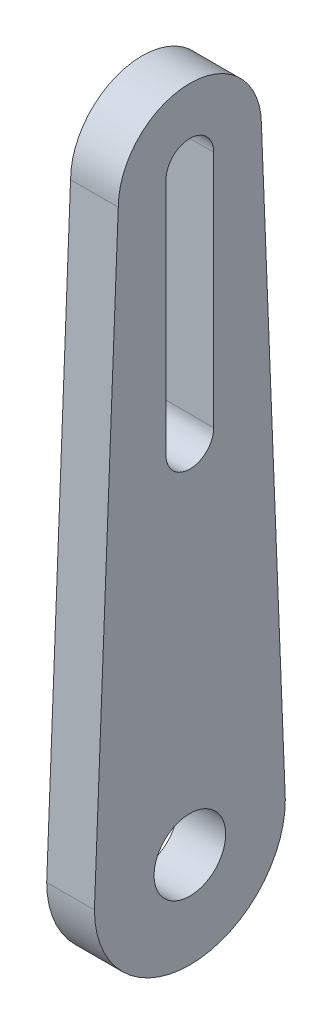
ISO-10303-21;
HEADER;
FILE_DESCRIPTION(('STEP AP214'),'2;1');
FILE_NAME('part.step','',(''),(''),'','','');
FILE_SCHEMA(('AUTOMOTIVE_DESIGN { 1 0 10303 214 1 1 1 1 }'));
ENDSEC;
DATA;
#1=APPLICATION_CONTEXT('core data for automotive mechanical design processes');
#2=APPLICATION_PROTOCOL_DEFINITION('international standard','automotive_design',2000,#1);
#3=PRODUCT_CONTEXT('',#1,'mechanical');
#4=PRODUCT('Part','Part','',(#3));
#5=PRODUCT_RELATED_PRODUCT_CATEGORY('part','',(#4));
#6=PRODUCT_DEFINITION_FORMATION('','',#4);
#7=PRODUCT_DEFINITION_CONTEXT('part definition',#1,'design');
#8=PRODUCT_DEFINITION('design','',#6,#7);
#9=PRODUCT_DEFINITION_SHAPE('','',#8);
#10=(LENGTH_UNIT() NAMED_UNIT(*) SI_UNIT(.MILLI.,.METRE.));
#11=(NAMED_UNIT(*) PLANE_ANGLE_UNIT() SI_UNIT($,.RADIAN.));
#12=(NAMED_UNIT(*) SI_UNIT($,.STERADIAN.) SOLID_ANGLE_UNIT());
#13=UNCERTAINTY_MEASURE_WITH_UNIT(LENGTH_MEASURE(1.E-05),#10,'distance_accuracy_value','');
#14=(GEOMETRIC_REPRESENTATION_CONTEXT(3) GLOBAL_UNCERTAINTY_ASSIGNED_CONTEXT((#13)) GLOBAL_UNIT_ASSIGNED_CONTEXT((#10,
#11,#12)) REPRESENTATION_CONTEXT('',''));
#15=CARTESIAN_POINT('',(0.,0.,0.));
#16=DIRECTION('',(0.,0.,1.));
#17=DIRECTION('',(1.,0.,0.));
#18=AXIS2_PLACEMENT_3D('',#15,#16,#17);
#19=CARTESIAN_POINT('',(2.,0.,0.));
#20=DIRECTION('',(1.,0.,0.));
#21=DIRECTION('',(0.,0.,-1.));
#22=AXIS2_PLACEMENT_3D('',#19,#20,#21);
#23=PLANE('',#22);
#24=CARTESIAN_POINT('',(2.,0.,0.));
#25=DIRECTION('',(1.,0.,0.));
#26=DIRECTION('',(0.,0.,-1.));
#27=AXIS2_PLACEMENT_3D('',#24,#25,#26);
#28=CIRCLE('',#27,8.);
#29=CARTESIAN_POINT('',(2.,0.,8.));
#30=VERTEX_POINT('',#29);
#31=CARTESIAN_POINT('',(2.,0.,-8.));
#32=VERTEX_POINT('',#31);
#33=EDGE_CURVE('E161',#30,#32,#28,.T.);
#34=ORIENTED_EDGE('',*,*,#33,.T.);
#35=DIRECTION('',(0.,0.999200958721789,0.0399680383488716));
#36=VECTOR('',#35,1.);
#37=CARTESIAN_POINT('',(2.,50.,-6.));
#38=LINE('',#37,#36);
#39=CARTESIAN_POINT('',(2.,50.,-6.));
#40=VERTEX_POINT('',#39);
#41=EDGE_CURVE('E165',#32,#40,#38,.T.);
#42=ORIENTED_EDGE('',*,*,#41,.T.);
#43=CARTESIAN_POINT('',(2.,50.,0.));
#44=DIRECTION('',(1.,0.,0.));
#45=DIRECTION('',(0.,0.,1.));
#46=AXIS2_PLACEMENT_3D('',#43,#44,#45);
#47=CIRCLE('',#46,6.);
#48=CARTESIAN_POINT('',(2.,50.,6.));
#49=VERTEX_POINT('',#48);
#50=EDGE_CURVE('E169',#40,#49,#47,.T.);
#51=ORIENTED_EDGE('',*,*,#50,.T.);
#52=DIRECTION('',(0.,-0.999200958721789,0.0399680383488716));
#53=VECTOR('',#52,1.);
#54=CARTESIAN_POINT('',(2.,0.,8.));
#55=LINE('',#54,#53);
#56=EDGE_CURVE('E172',#49,#30,#55,.T.);
#57=ORIENTED_EDGE('',*,*,#56,.T.);
#58=EDGE_LOOP('',(#34,#42,#51,#57));
#59=FACE_BOUND('',#58,.T.);
#60=CARTESIAN_POINT('',(2.,0.,0.));
#61=DIRECTION('',(1.,0.,0.));
#62=DIRECTION('',(0.,0.,-1.));
#63=AXIS2_PLACEMENT_3D('',#60,#61,#62);
#64=CIRCLE('',#63,3.);
#65=CARTESIAN_POINT('',(2.,0.,-3.));
#66=VERTEX_POINT('',#65);
#67=EDGE_CURVE('E153',#66,#66,#64,.T.);
#68=ORIENTED_EDGE('',*,*,#67,.F.);
#69=EDGE_LOOP('',(#68));
#70=FACE_BOUND('',#69,.T.);
#71=DIRECTION('',(0.,-1.,0.));
#72=VECTOR('',#71,1.);
#73=CARTESIAN_POINT('',(2.,50.,1.99999999999999));
#74=LINE('',#73,#72);
#75=CARTESIAN_POINT('',(2.,50.,1.99999999999999));
#76=VERTEX_POINT('',#75);
#77=CARTESIAN_POINT('',(2.,30.,2.));
#78=VERTEX_POINT('',#77);
#79=EDGE_CURVE('E114',#76,#78,#74,.T.);
#80=ORIENTED_EDGE('',*,*,#79,.F.);
#81=CARTESIAN_POINT('',(2.,50.,0.));
#82=DIRECTION('',(1.,0.,0.));
#83=DIRECTION('',(0.,0.,-1.));
#84=AXIS2_PLACEMENT_3D('',#81,#82,#83);
#85=CIRCLE('',#84,2.);
#86=CARTESIAN_POINT('',(2.,50.,-2.00000000000001));
#87=VERTEX_POINT('',#86);
#88=EDGE_CURVE('E105',#87,#76,#85,.T.);
#89=ORIENTED_EDGE('',*,*,#88,.F.);
#90=DIRECTION('',(0.,1.,0.));
#91=VECTOR('',#90,1.);
#92=CARTESIAN_POINT('',(2.,50.,-2.00000000000001));
#93=LINE('',#92,#91);
#94=CARTESIAN_POINT('',(2.,30.,-2.));
#95=VERTEX_POINT('',#94);
#96=EDGE_CURVE('E131',#95,#87,#93,.T.);
#97=ORIENTED_EDGE('',*,*,#96,.F.);
#98=CARTESIAN_POINT('',(2.,30.,0.));
#99=DIRECTION('',(1.,0.,0.));
#100=DIRECTION('',(0.,0.,-1.));
#101=AXIS2_PLACEMENT_3D('',#98,#99,#100);
#102=CIRCLE('',#101,2.);
#103=EDGE_CURVE('E127',#78,#95,#102,.T.);
#104=ORIENTED_EDGE('',*,*,#103,.F.);
#105=EDGE_LOOP('',(#80,#89,#97,#104));
#106=FACE_BOUND('',#105,.T.);
#107=ADVANCED_FACE('F39',(#59,#70,#106),#23,.T.);
#108=CARTESIAN_POINT('',(-2.,0.,0.));
#109=DIRECTION('',(1.,0.,0.));
#110=DIRECTION('',(0.,0.,-1.));
#111=AXIS2_PLACEMENT_3D('',#108,#109,#110);
#112=PLANE('',#111);
#113=CARTESIAN_POINT('',(-2.,0.,0.));
#114=DIRECTION('',(1.,0.,0.));
#115=DIRECTION('',(0.,0.,-1.));
#116=AXIS2_PLACEMENT_3D('',#113,#114,#115);
#117=CIRCLE('',#116,3.);
#118=CARTESIAN_POINT('',(-2.,0.,-3.));
#119=VERTEX_POINT('',#118);
#120=EDGE_CURVE('E123',#119,#119,#117,.T.);
#121=ORIENTED_EDGE('',*,*,#120,.T.);
#122=EDGE_LOOP('',(#121));
#123=FACE_BOUND('',#122,.T.);
#124=CARTESIAN_POINT('',(-2.,0.,0.));
#125=DIRECTION('',(1.,0.,0.));
#126=DIRECTION('',(0.,0.,-1.));
#127=AXIS2_PLACEMENT_3D('',#124,#125,#126);
#128=CIRCLE('',#127,8.);
#129=CARTESIAN_POINT('',(-2.,0.,8.));
#130=VERTEX_POINT('',#129);
#131=CARTESIAN_POINT('',(-2.,0.,-8.));
#132=VERTEX_POINT('',#131);
#133=EDGE_CURVE('E157',#130,#132,#128,.T.);
#134=ORIENTED_EDGE('',*,*,#133,.F.);
#135=DIRECTION('',(0.,-0.999200958721789,0.0399680383488716));
#136=VECTOR('',#135,1.);
#137=CARTESIAN_POINT('',(-2.,0.,8.));
#138=LINE('',#137,#136);
#139=CARTESIAN_POINT('',(-2.,50.,6.));
#140=VERTEX_POINT('',#139);
#141=EDGE_CURVE('E166',#140,#130,#138,.T.);
#142=ORIENTED_EDGE('',*,*,#141,.F.);
#143=CARTESIAN_POINT('',(-2.,50.,0.));
#144=DIRECTION('',(1.,0.,0.));
#145=DIRECTION('',(0.,0.,1.));
#146=AXIS2_PLACEMENT_3D('',#143,#144,#145);
#147=CIRCLE('',#146,6.);
#148=CARTESIAN_POINT('',(-2.,50.,-6.));
#149=VERTEX_POINT('',#148);
#150=EDGE_CURVE('E182',#149,#140,#147,.T.);
#151=ORIENTED_EDGE('',*,*,#150,.F.);
#152=DIRECTION('',(0.,0.999200958721789,0.0399680383488716));
#153=VECTOR('',#152,1.);
#154=CARTESIAN_POINT('',(-2.,50.,-6.));
#155=LINE('',#154,#153);
#156=EDGE_CURVE('E179',#132,#149,#155,.T.);
#157=ORIENTED_EDGE('',*,*,#156,.F.);
#158=EDGE_LOOP('',(#134,#142,#151,#157));
#159=FACE_BOUND('',#158,.T.);
#160=CARTESIAN_POINT('',(-2.,50.,0.));
#161=DIRECTION('',(1.,0.,0.));
#162=DIRECTION('',(0.,0.,-1.));
#163=AXIS2_PLACEMENT_3D('',#160,#161,#162);
#164=CIRCLE('',#163,2.);
#165=CARTESIAN_POINT('',(-2.,50.,-2.00000000000001));
#166=VERTEX_POINT('',#165);
#167=CARTESIAN_POINT('',(-2.,50.,1.99999999999999));
#168=VERTEX_POINT('',#167);
#169=EDGE_CURVE('E63',#166,#168,#164,.T.);
#170=ORIENTED_EDGE('',*,*,#169,.T.);
#171=DIRECTION('',(0.,-1.,0.));
#172=VECTOR('',#171,1.);
#173=CARTESIAN_POINT('',(-2.,50.,1.99999999999999));
#174=LINE('',#173,#172);
#175=CARTESIAN_POINT('',(-2.,30.,2.));
#176=VERTEX_POINT('',#175);
#177=EDGE_CURVE('E121',#168,#176,#174,.T.);
#178=ORIENTED_EDGE('',*,*,#177,.T.);
#179=CARTESIAN_POINT('',(-2.,30.,0.));
#180=DIRECTION('',(1.,0.,0.));
#181=DIRECTION('',(0.,0.,-1.));
#182=AXIS2_PLACEMENT_3D('',#179,#180,#181);
#183=CIRCLE('',#182,2.);
#184=CARTESIAN_POINT('',(-2.,30.,-2.));
#185=VERTEX_POINT('',#184);
#186=EDGE_CURVE('E140',#176,#185,#183,.T.);
#187=ORIENTED_EDGE('',*,*,#186,.T.);
#188=DIRECTION('',(0.,1.,0.));
#189=VECTOR('',#188,1.);
#190=CARTESIAN_POINT('',(-2.,50.,-2.00000000000001));
#191=LINE('',#190,#189);
#192=EDGE_CURVE('E115',#185,#166,#191,.T.);
#193=ORIENTED_EDGE('',*,*,#192,.T.);
#194=EDGE_LOOP('',(#170,#178,#187,#193));
#195=FACE_BOUND('',#194,.T.);
#196=ADVANCED_FACE('F205',(#123,#159,#195),#112,.F.);
#197=CARTESIAN_POINT('',(2.,0.,0.));
#198=DIRECTION('',(-1.,0.,0.));
#199=DIRECTION('',(0.,0.,1.));
#200=AXIS2_PLACEMENT_3D('',#197,#198,#199);
#201=CYLINDRICAL_SURFACE('',#200,8.);
#202=ORIENTED_EDGE('',*,*,#133,.T.);
#203=DIRECTION('',(-1.,0.,0.));
#204=VECTOR('',#203,1.);
#205=CARTESIAN_POINT('',(2.,0.,-8.));
#206=LINE('',#205,#204);
#207=EDGE_CURVE('E11',#32,#132,#206,.T.);
#208=ORIENTED_EDGE('',*,*,#207,.F.);
#209=ORIENTED_EDGE('',*,*,#33,.F.);
#210=DIRECTION('',(-1.,0.,0.));
#211=VECTOR('',#210,1.);
#212=CARTESIAN_POINT('',(2.,0.,8.));
#213=LINE('',#212,#211);
#214=EDGE_CURVE('E175',#30,#130,#213,.T.);
#215=ORIENTED_EDGE('',*,*,#214,.T.);
#216=EDGE_LOOP('',(#202,#208,#209,#215));
#217=FACE_BOUND('',#216,.T.);
#218=ADVANCED_FACE('F41',(#217),#201,.T.);
#219=CARTESIAN_POINT('',(2.,50.,-6.));
#220=DIRECTION('',(0.,-0.0399680383488716,0.999200958721789));
#221=DIRECTION('',(0.,-0.999200958721789,-0.0399680383488716));
#222=AXIS2_PLACEMENT_3D('',#219,#220,#221);
#223=PLANE('',#222);
#224=ORIENTED_EDGE('',*,*,#156,.T.);
#225=DIRECTION('',(-1.,0.,0.));
#226=VECTOR('',#225,1.);
#227=CARTESIAN_POINT('',(2.,50.,-6.));
#228=LINE('',#227,#226);
#229=EDGE_CURVE('E48',#40,#149,#228,.T.);
#230=ORIENTED_EDGE('',*,*,#229,.F.);
#231=ORIENTED_EDGE('',*,*,#41,.F.);
#232=ORIENTED_EDGE('',*,*,#207,.T.);
#233=EDGE_LOOP('',(#224,#230,#231,#232));
#234=FACE_BOUND('',#233,.T.);
#235=ADVANCED_FACE('F216',(#234),#223,.F.);
#236=CARTESIAN_POINT('',(2.,50.,0.));
#237=DIRECTION('',(-1.,0.,0.));
#238=DIRECTION('',(0.,0.,1.));
#239=AXIS2_PLACEMENT_3D('',#236,#237,#238);
#240=CYLINDRICAL_SURFACE('',#239,6.);
#241=ORIENTED_EDGE('',*,*,#150,.T.);
#242=DIRECTION('',(-1.,0.,0.));
#243=VECTOR('',#242,1.);
#244=CARTESIAN_POINT('',(2.,50.,6.));
#245=LINE('',#244,#243);
#246=EDGE_CURVE('E190',#49,#140,#245,.T.);
#247=ORIENTED_EDGE('',*,*,#246,.F.);
#248=ORIENTED_EDGE('',*,*,#50,.F.);
#249=ORIENTED_EDGE('',*,*,#229,.T.);
#250=EDGE_LOOP('',(#241,#247,#248,#249));
#251=FACE_BOUND('',#250,.T.);
#252=ADVANCED_FACE('F199',(#251),#240,.T.);
#253=CARTESIAN_POINT('',(2.,0.,8.));
#254=DIRECTION('',(0.,-0.0399680383488716,-0.999200958721789));
#255=DIRECTION('',(0.,0.999200958721789,-0.0399680383488716));
#256=AXIS2_PLACEMENT_3D('',#253,#254,#255);
#257=PLANE('',#256);
#258=ORIENTED_EDGE('',*,*,#141,.T.);
#259=ORIENTED_EDGE('',*,*,#214,.F.);
#260=ORIENTED_EDGE('',*,*,#56,.F.);
#261=ORIENTED_EDGE('',*,*,#246,.T.);
#262=EDGE_LOOP('',(#258,#259,#260,#261));
#263=FACE_BOUND('',#262,.T.);
#264=ADVANCED_FACE('F209',(#263),#257,.F.);
#265=CARTESIAN_POINT('',(2.,0.,0.));
#266=DIRECTION('',(-1.,0.,0.));
#267=DIRECTION('',(0.,0.,1.));
#268=AXIS2_PLACEMENT_3D('',#265,#266,#267);
#269=CYLINDRICAL_SURFACE('',#268,3.);
#270=ORIENTED_EDGE('',*,*,#67,.T.);
#271=EDGE_LOOP('',(#270));
#272=FACE_BOUND('',#271,.T.);
#273=ORIENTED_EDGE('',*,*,#120,.F.);
#274=EDGE_LOOP('',(#273));
#275=FACE_BOUND('',#274,.T.);
#276=ADVANCED_FACE('F231',(#272,#275),#269,.F.);
#277=CARTESIAN_POINT('',(2.,50.,0.));
#278=DIRECTION('',(-1.,0.,0.));
#279=DIRECTION('',(0.,0.,1.));
#280=AXIS2_PLACEMENT_3D('',#277,#278,#279);
#281=CYLINDRICAL_SURFACE('',#280,2.);
#282=ORIENTED_EDGE('',*,*,#169,.F.);
#283=DIRECTION('',(-1.,0.,0.));
#284=VECTOR('',#283,1.);
#285=CARTESIAN_POINT('',(2.,50.,-2.00000000000001));
#286=LINE('',#285,#284);
#287=EDGE_CURVE('E109',#87,#166,#286,.T.);
#288=ORIENTED_EDGE('',*,*,#287,.F.);
#289=ORIENTED_EDGE('',*,*,#88,.T.);
#290=DIRECTION('',(-1.,0.,0.));
#291=VECTOR('',#290,1.);
#292=CARTESIAN_POINT('',(2.,50.,1.99999999999999));
#293=LINE('',#292,#291);
#294=EDGE_CURVE('E108',#76,#168,#293,.T.);
#295=ORIENTED_EDGE('',*,*,#294,.T.);
#296=EDGE_LOOP('',(#282,#288,#289,#295));
#297=FACE_BOUND('',#296,.T.);
#298=ADVANCED_FACE('F107',(#297),#281,.F.);
#299=CARTESIAN_POINT('',(2.,50.,1.99999999999999));
#300=DIRECTION('',(0.,0.,-1.));
#301=DIRECTION('',(0.,1.,0.));
#302=AXIS2_PLACEMENT_3D('',#299,#300,#301);
#303=PLANE('',#302);
#304=ORIENTED_EDGE('',*,*,#177,.F.);
#305=ORIENTED_EDGE('',*,*,#294,.F.);
#306=ORIENTED_EDGE('',*,*,#79,.T.);
#307=DIRECTION('',(-1.,0.,0.));
#308=VECTOR('',#307,1.);
#309=CARTESIAN_POINT('',(2.,30.,2.));
#310=LINE('',#309,#308);
#311=EDGE_CURVE('E124',#78,#176,#310,.T.);
#312=ORIENTED_EDGE('',*,*,#311,.T.);
#313=EDGE_LOOP('',(#304,#305,#306,#312));
#314=FACE_BOUND('',#313,.T.);
#315=ADVANCED_FACE('F118',(#314),#303,.T.);
#316=CARTESIAN_POINT('',(2.,30.,0.));
#317=DIRECTION('',(-1.,0.,0.));
#318=DIRECTION('',(0.,0.,1.));
#319=AXIS2_PLACEMENT_3D('',#316,#317,#318);
#320=CYLINDRICAL_SURFACE('',#319,2.);
#321=ORIENTED_EDGE('',*,*,#186,.F.);
#322=ORIENTED_EDGE('',*,*,#311,.F.);
#323=ORIENTED_EDGE('',*,*,#103,.T.);
#324=DIRECTION('',(-1.,0.,0.));
#325=VECTOR('',#324,1.);
#326=CARTESIAN_POINT('',(2.,30.,-2.));
#327=LINE('',#326,#325);
#328=EDGE_CURVE('E55',#95,#185,#327,.T.);
#329=ORIENTED_EDGE('',*,*,#328,.T.);
#330=EDGE_LOOP('',(#321,#322,#323,#329));
#331=FACE_BOUND('',#330,.T.);
#332=ADVANCED_FACE('F248',(#331),#320,.F.);
#333=CARTESIAN_POINT('',(2.,50.,-2.00000000000001));
#334=DIRECTION('',(0.,0.,1.));
#335=DIRECTION('',(0.,-1.,0.));
#336=AXIS2_PLACEMENT_3D('',#333,#334,#335);
#337=PLANE('',#336);
#338=ORIENTED_EDGE('',*,*,#192,.F.);
#339=ORIENTED_EDGE('',*,*,#328,.F.);
#340=ORIENTED_EDGE('',*,*,#96,.T.);
#341=ORIENTED_EDGE('',*,*,#287,.T.);
#342=EDGE_LOOP('',(#338,#339,#340,#341));
#343=FACE_BOUND('',#342,.T.);
#344=ADVANCED_FACE('F253',(#343),#337,.T.);
#345=CLOSED_SHELL('',(#107,#196,#218,#235,#252,#264,#276,#298,#315,#332,#344));
#346=MANIFOLD_SOLID_BREP('B2',#345);
#347=ADVANCED_BREP_SHAPE_REPRESENTATION('',(#18,#346),#14);
#348=SHAPE_DEFINITION_REPRESENTATION(#9,#347);
ENDSEC;
END-ISO-10303-21;
